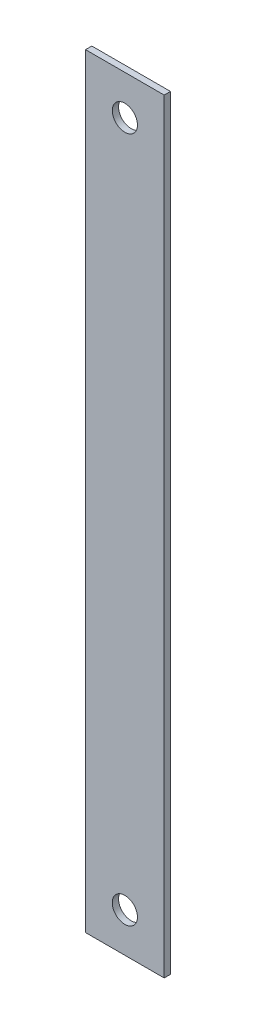
ISO-10303-21;
HEADER;
FILE_DESCRIPTION(('STEP AP214'),'2;1');
FILE_NAME('part.step','',(''),(''),'','','');
FILE_SCHEMA(('AUTOMOTIVE_DESIGN { 1 0 10303 214 1 1 1 1 }'));
ENDSEC;
DATA;
#1=APPLICATION_CONTEXT('core data for automotive mechanical design processes');
#2=APPLICATION_PROTOCOL_DEFINITION('international standard','automotive_design',2000,#1);
#3=PRODUCT_CONTEXT('',#1,'mechanical');
#4=PRODUCT('Part','Part','',(#3));
#5=PRODUCT_RELATED_PRODUCT_CATEGORY('part','',(#4));
#6=PRODUCT_DEFINITION_FORMATION('','',#4);
#7=PRODUCT_DEFINITION_CONTEXT('part definition',#1,'design');
#8=PRODUCT_DEFINITION('design','',#6,#7);
#9=PRODUCT_DEFINITION_SHAPE('','',#8);
#10=(LENGTH_UNIT() NAMED_UNIT(*) SI_UNIT(.MILLI.,.METRE.));
#11=(NAMED_UNIT(*) PLANE_ANGLE_UNIT() SI_UNIT($,.RADIAN.));
#12=(NAMED_UNIT(*) SI_UNIT($,.STERADIAN.) SOLID_ANGLE_UNIT());
#13=UNCERTAINTY_MEASURE_WITH_UNIT(LENGTH_MEASURE(1.E-05),#10,'distance_accuracy_value','');
#14=(GEOMETRIC_REPRESENTATION_CONTEXT(3) GLOBAL_UNCERTAINTY_ASSIGNED_CONTEXT((#13)) GLOBAL_UNIT_ASSIGNED_CONTEXT((#10,
#11,#12)) REPRESENTATION_CONTEXT('',''));
#15=CARTESIAN_POINT('',(0.,0.,0.));
#16=DIRECTION('',(0.,0.,1.));
#17=DIRECTION('',(1.,0.,0.));
#18=AXIS2_PLACEMENT_3D('',#15,#16,#17);
#19=CARTESIAN_POINT('',(0.,0.,2.));
#20=DIRECTION('',(0.,0.,1.));
#21=DIRECTION('',(1.,0.,0.));
#22=AXIS2_PLACEMENT_3D('',#19,#20,#21);
#23=PLANE('',#22);
#24=CARTESIAN_POINT('',(0.,109.,2.));
#25=DIRECTION('',(0.,0.,1.));
#26=DIRECTION('',(1.,0.,0.));
#27=AXIS2_PLACEMENT_3D('',#24,#25,#26);
#28=CIRCLE('',#27,4.);
#29=CARTESIAN_POINT('',(4.,109.,2.));
#30=VERTEX_POINT('',#29);
#31=EDGE_CURVE('E101',#30,#30,#28,.T.);
#32=ORIENTED_EDGE('',*,*,#31,.F.);
#33=EDGE_LOOP('',(#32));
#34=FACE_BOUND('',#33,.T.);
#35=DIRECTION('',(0.,1.,0.));
#36=VECTOR('',#35,1.);
#37=CARTESIAN_POINT('',(12.5,121.5,2.));
#38=LINE('',#37,#36);
#39=CARTESIAN_POINT('',(12.5,-121.5,2.));
#40=VERTEX_POINT('',#39);
#41=CARTESIAN_POINT('',(12.5,121.5,2.));
#42=VERTEX_POINT('',#41);
#43=EDGE_CURVE('E83',#40,#42,#38,.T.);
#44=ORIENTED_EDGE('',*,*,#43,.T.);
#45=DIRECTION('',(-1.,0.,0.));
#46=VECTOR('',#45,1.);
#47=CARTESIAN_POINT('',(3.5000000000001,121.5,2.));
#48=LINE('',#47,#46);
#49=CARTESIAN_POINT('',(-12.5,121.5,2.));
#50=VERTEX_POINT('',#49);
#51=EDGE_CURVE('E77',#42,#50,#48,.T.);
#52=ORIENTED_EDGE('',*,*,#51,.T.);
#53=DIRECTION('',(-1.64423508113657E-12,-1.,0.));
#54=VECTOR('',#53,1.);
#55=CARTESIAN_POINT('',(-12.5,121.482064426535,2.));
#56=LINE('',#55,#54);
#57=CARTESIAN_POINT('',(-12.5,-121.5,2.));
#58=VERTEX_POINT('',#57);
#59=EDGE_CURVE('E80',#50,#58,#56,.T.);
#60=ORIENTED_EDGE('',*,*,#59,.T.);
#61=DIRECTION('',(1.,0.,0.));
#62=VECTOR('',#61,1.);
#63=CARTESIAN_POINT('',(-12.5,-121.5,2.));
#64=LINE('',#63,#62);
#65=EDGE_CURVE('E50',#58,#40,#64,.T.);
#66=ORIENTED_EDGE('',*,*,#65,.T.);
#67=EDGE_LOOP('',(#44,#52,#60,#66));
#68=FACE_BOUND('',#67,.T.);
#69=CARTESIAN_POINT('',(0.,-109.,2.));
#70=DIRECTION('',(0.,0.,1.));
#71=DIRECTION('',(-1.,0.,0.));
#72=AXIS2_PLACEMENT_3D('',#69,#70,#71);
#73=CIRCLE('',#72,4.);
#74=CARTESIAN_POINT('',(-4.,-109.,2.));
#75=VERTEX_POINT('',#74);
#76=EDGE_CURVE('E113',#75,#75,#73,.T.);
#77=ORIENTED_EDGE('',*,*,#76,.F.);
#78=EDGE_LOOP('',(#77));
#79=FACE_BOUND('',#78,.T.);
#80=ADVANCED_FACE('F33',(#34,#68,#79),#23,.T.);
#81=CARTESIAN_POINT('',(0.,0.,0.));
#82=DIRECTION('',(0.,0.,1.));
#83=DIRECTION('',(1.,0.,0.));
#84=AXIS2_PLACEMENT_3D('',#81,#82,#83);
#85=PLANE('',#84);
#86=DIRECTION('',(0.,1.,0.));
#87=VECTOR('',#86,1.);
#88=CARTESIAN_POINT('',(12.5,121.5,0.));
#89=LINE('',#88,#87);
#90=CARTESIAN_POINT('',(12.5,-121.5,0.));
#91=VERTEX_POINT('',#90);
#92=CARTESIAN_POINT('',(12.5,121.5,0.));
#93=VERTEX_POINT('',#92);
#94=EDGE_CURVE('E98',#91,#93,#89,.T.);
#95=ORIENTED_EDGE('',*,*,#94,.F.);
#96=DIRECTION('',(1.,0.,0.));
#97=VECTOR('',#96,1.);
#98=CARTESIAN_POINT('',(3.50000000000013,-121.5,0.));
#99=LINE('',#98,#97);
#100=CARTESIAN_POINT('',(-12.5,-121.5,0.));
#101=VERTEX_POINT('',#100);
#102=EDGE_CURVE('E66',#101,#91,#99,.T.);
#103=ORIENTED_EDGE('',*,*,#102,.F.);
#104=DIRECTION('',(0.,-1.,0.));
#105=VECTOR('',#104,1.);
#106=CARTESIAN_POINT('',(-12.5,-115.487492177719,0.));
#107=LINE('',#106,#105);
#108=CARTESIAN_POINT('',(-12.5,121.5,0.));
#109=VERTEX_POINT('',#108);
#110=EDGE_CURVE('E103',#109,#101,#107,.T.);
#111=ORIENTED_EDGE('',*,*,#110,.F.);
#112=DIRECTION('',(-1.,0.,0.));
#113=VECTOR('',#112,1.);
#114=CARTESIAN_POINT('',(-12.5,121.5,0.));
#115=LINE('',#114,#113);
#116=EDGE_CURVE('E89',#93,#109,#115,.T.);
#117=ORIENTED_EDGE('',*,*,#116,.F.);
#118=EDGE_LOOP('',(#95,#103,#111,#117));
#119=FACE_BOUND('',#118,.T.);
#120=CARTESIAN_POINT('',(0.,109.,0.));
#121=DIRECTION('',(0.,0.,1.));
#122=DIRECTION('',(1.,0.,0.));
#123=AXIS2_PLACEMENT_3D('',#120,#121,#122);
#124=CIRCLE('',#123,4.);
#125=CARTESIAN_POINT('',(4.,109.,0.));
#126=VERTEX_POINT('',#125);
#127=EDGE_CURVE('E110',#126,#126,#124,.T.);
#128=ORIENTED_EDGE('',*,*,#127,.T.);
#129=EDGE_LOOP('',(#128));
#130=FACE_BOUND('',#129,.T.);
#131=CARTESIAN_POINT('',(0.,-109.,0.));
#132=DIRECTION('',(0.,0.,1.));
#133=DIRECTION('',(-1.,0.,0.));
#134=AXIS2_PLACEMENT_3D('',#131,#132,#133);
#135=CIRCLE('',#134,4.);
#136=CARTESIAN_POINT('',(-4.,-109.,0.));
#137=VERTEX_POINT('',#136);
#138=EDGE_CURVE('E116',#137,#137,#135,.T.);
#139=ORIENTED_EDGE('',*,*,#138,.T.);
#140=EDGE_LOOP('',(#139));
#141=FACE_BOUND('',#140,.T.);
#142=ADVANCED_FACE('F125',(#119,#130,#141),#85,.F.);
#143=CARTESIAN_POINT('',(12.5,121.5,2.));
#144=DIRECTION('',(-1.,0.,0.));
#145=DIRECTION('',(0.,0.,1.));
#146=AXIS2_PLACEMENT_3D('',#143,#144,#145);
#147=PLANE('',#146);
#148=ORIENTED_EDGE('',*,*,#94,.T.);
#149=DIRECTION('',(0.,0.,-1.));
#150=VECTOR('',#149,1.);
#151=CARTESIAN_POINT('',(12.5,121.5,2.));
#152=LINE('',#151,#150);
#153=EDGE_CURVE('E11',#42,#93,#152,.T.);
#154=ORIENTED_EDGE('',*,*,#153,.F.);
#155=ORIENTED_EDGE('',*,*,#43,.F.);
#156=DIRECTION('',(0.,0.,-1.));
#157=VECTOR('',#156,1.);
#158=CARTESIAN_POINT('',(12.5,-121.5,2.));
#159=LINE('',#158,#157);
#160=EDGE_CURVE('E94',#40,#91,#159,.T.);
#161=ORIENTED_EDGE('',*,*,#160,.T.);
#162=EDGE_LOOP('',(#148,#154,#155,#161));
#163=FACE_BOUND('',#162,.T.);
#164=ADVANCED_FACE('F35',(#163),#147,.F.);
#165=CARTESIAN_POINT('',(-12.5,121.5,2.));
#166=DIRECTION('',(0.,-1.,0.));
#167=DIRECTION('',(0.,0.,-1.));
#168=AXIS2_PLACEMENT_3D('',#165,#166,#167);
#169=PLANE('',#168);
#170=ORIENTED_EDGE('',*,*,#116,.T.);
#171=DIRECTION('',(0.,0.,-1.));
#172=VECTOR('',#171,1.);
#173=CARTESIAN_POINT('',(-12.5,121.5,2.));
#174=LINE('',#173,#172);
#175=EDGE_CURVE('E42',#50,#109,#174,.T.);
#176=ORIENTED_EDGE('',*,*,#175,.F.);
#177=ORIENTED_EDGE('',*,*,#51,.F.);
#178=ORIENTED_EDGE('',*,*,#153,.T.);
#179=EDGE_LOOP('',(#170,#176,#177,#178));
#180=FACE_BOUND('',#179,.T.);
#181=ADVANCED_FACE('F88',(#180),#169,.F.);
#182=CARTESIAN_POINT('',(-12.5,-115.487492177719,2.));
#183=DIRECTION('',(1.,0.,0.));
#184=DIRECTION('',(0.,0.,-1.));
#185=AXIS2_PLACEMENT_3D('',#182,#183,#184);
#186=PLANE('',#185);
#187=ORIENTED_EDGE('',*,*,#110,.T.);
#188=DIRECTION('',(0.,0.,-1.));
#189=VECTOR('',#188,1.);
#190=CARTESIAN_POINT('',(-12.5,-121.5,2.));
#191=LINE('',#190,#189);
#192=EDGE_CURVE('E91',#58,#101,#191,.T.);
#193=ORIENTED_EDGE('',*,*,#192,.F.);
#194=ORIENTED_EDGE('',*,*,#59,.F.);
#195=ORIENTED_EDGE('',*,*,#175,.T.);
#196=EDGE_LOOP('',(#187,#193,#194,#195));
#197=FACE_BOUND('',#196,.T.);
#198=ADVANCED_FACE('F92',(#197),#186,.F.);
#199=CARTESIAN_POINT('',(3.50000000000013,-121.5,2.));
#200=DIRECTION('',(0.,1.,0.));
#201=DIRECTION('',(0.,0.,1.));
#202=AXIS2_PLACEMENT_3D('',#199,#200,#201);
#203=PLANE('',#202);
#204=ORIENTED_EDGE('',*,*,#102,.T.);
#205=ORIENTED_EDGE('',*,*,#160,.F.);
#206=ORIENTED_EDGE('',*,*,#65,.F.);
#207=ORIENTED_EDGE('',*,*,#192,.T.);
#208=EDGE_LOOP('',(#204,#205,#206,#207));
#209=FACE_BOUND('',#208,.T.);
#210=ADVANCED_FACE('F107',(#209),#203,.F.);
#211=CARTESIAN_POINT('',(0.,109.,2.));
#212=DIRECTION('',(0.,0.,-1.));
#213=DIRECTION('',(-1.,0.,0.));
#214=AXIS2_PLACEMENT_3D('',#211,#212,#213);
#215=CYLINDRICAL_SURFACE('',#214,4.);
#216=ORIENTED_EDGE('',*,*,#31,.T.);
#217=EDGE_LOOP('',(#216));
#218=FACE_BOUND('',#217,.T.);
#219=ORIENTED_EDGE('',*,*,#127,.F.);
#220=EDGE_LOOP('',(#219));
#221=FACE_BOUND('',#220,.T.);
#222=ADVANCED_FACE('F134',(#218,#221),#215,.F.);
#223=CARTESIAN_POINT('',(0.,-109.,2.));
#224=DIRECTION('',(0.,0.,-1.));
#225=DIRECTION('',(-1.,0.,0.));
#226=AXIS2_PLACEMENT_3D('',#223,#224,#225);
#227=CYLINDRICAL_SURFACE('',#226,4.);
#228=ORIENTED_EDGE('',*,*,#76,.T.);
#229=EDGE_LOOP('',(#228));
#230=FACE_BOUND('',#229,.T.);
#231=ORIENTED_EDGE('',*,*,#138,.F.);
#232=EDGE_LOOP('',(#231));
#233=FACE_BOUND('',#232,.T.);
#234=ADVANCED_FACE('F122',(#230,#233),#227,.F.);
#235=CLOSED_SHELL('',(#80,#142,#164,#181,#198,#210,#222,#234));
#236=MANIFOLD_SOLID_BREP('B2',#235);
#237=ADVANCED_BREP_SHAPE_REPRESENTATION('',(#18,#236),#14);
#238=SHAPE_DEFINITION_REPRESENTATION(#9,#237);
ENDSEC;
END-ISO-10303-21;
